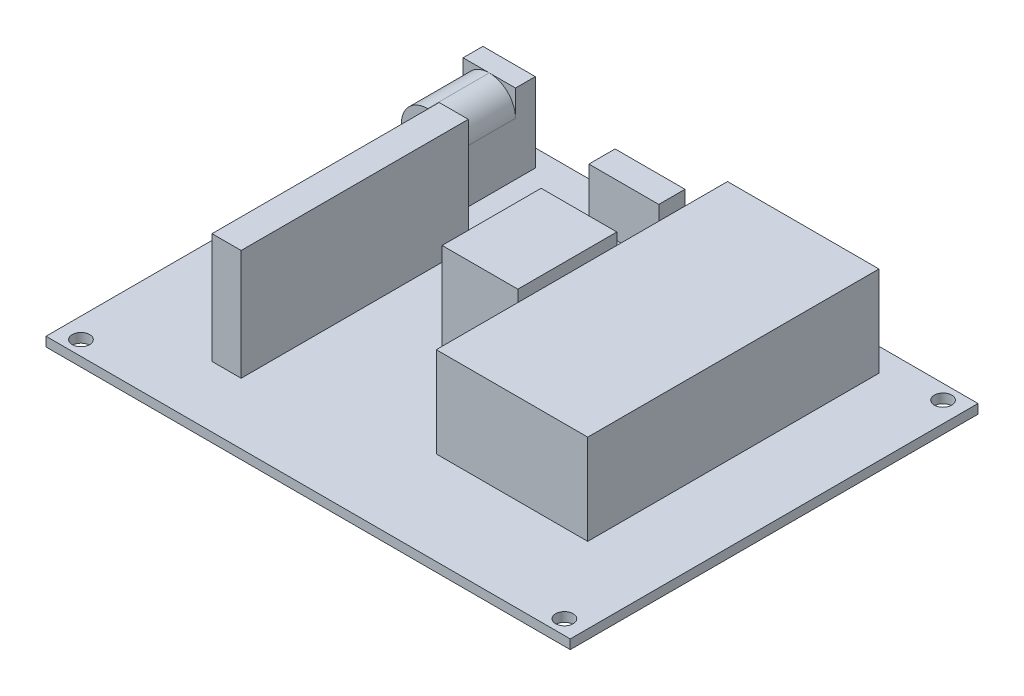
ISO-10303-21;
HEADER;
FILE_DESCRIPTION(('STEP AP214'),'2;1');
FILE_NAME('part.step','',(''),(''),'','','');
FILE_SCHEMA(('AUTOMOTIVE_DESIGN { 1 0 10303 214 1 1 1 1 }'));
ENDSEC;
DATA;
#1=APPLICATION_CONTEXT('core data for automotive mechanical design processes');
#2=APPLICATION_PROTOCOL_DEFINITION('international standard','automotive_design',2000,#1);
#3=PRODUCT_CONTEXT('',#1,'mechanical');
#4=PRODUCT('Part','Part','',(#3));
#5=PRODUCT_RELATED_PRODUCT_CATEGORY('part','',(#4));
#6=PRODUCT_DEFINITION_FORMATION('','',#4);
#7=PRODUCT_DEFINITION_CONTEXT('part definition',#1,'design');
#8=PRODUCT_DEFINITION('design','',#6,#7);
#9=PRODUCT_DEFINITION_SHAPE('','',#8);
#10=(LENGTH_UNIT() NAMED_UNIT(*) SI_UNIT(.MILLI.,.METRE.));
#11=(NAMED_UNIT(*) PLANE_ANGLE_UNIT() SI_UNIT($,.RADIAN.));
#12=(NAMED_UNIT(*) SI_UNIT($,.STERADIAN.) SOLID_ANGLE_UNIT());
#13=UNCERTAINTY_MEASURE_WITH_UNIT(LENGTH_MEASURE(1.E-05),#10,'distance_accuracy_value','');
#14=(GEOMETRIC_REPRESENTATION_CONTEXT(3) GLOBAL_UNCERTAINTY_ASSIGNED_CONTEXT((#13)) GLOBAL_UNIT_ASSIGNED_CONTEXT((#10,
#11,#12)) REPRESENTATION_CONTEXT('',''));
#15=CARTESIAN_POINT('',(0.,0.,0.));
#16=DIRECTION('',(0.,0.,1.));
#17=DIRECTION('',(1.,0.,0.));
#18=AXIS2_PLACEMENT_3D('',#15,#16,#17);
#19=CARTESIAN_POINT('',(0.,1.6,0.));
#20=DIRECTION('',(0.,-1.,0.));
#21=DIRECTION('',(0.,0.,-1.));
#22=AXIS2_PLACEMENT_3D('',#19,#20,#21);
#23=PLANE('',#22);
#24=DIRECTION('',(0.,0.,-1.));
#25=VECTOR('',#24,1.);
#26=CARTESIAN_POINT('',(-28.,1.6,-18.));
#27=LINE('',#26,#25);
#28=CARTESIAN_POINT('',(-28.,1.6,-18.));
#29=VERTEX_POINT('',#28);
#30=CARTESIAN_POINT('',(-28.,1.6,-32.));
#31=VERTEX_POINT('',#30);
#32=EDGE_CURVE('E247',#29,#31,#27,.T.);
#33=ORIENTED_EDGE('',*,*,#32,.F.);
#34=DIRECTION('',(1.,0.,0.));
#35=VECTOR('',#34,1.);
#36=CARTESIAN_POINT('',(-37.,1.6,-18.));
#37=LINE('',#36,#35);
#38=CARTESIAN_POINT('',(-37.,1.6,-18.));
#39=VERTEX_POINT('',#38);
#40=EDGE_CURVE('E254',#39,#29,#37,.T.);
#41=ORIENTED_EDGE('',*,*,#40,.F.);
#42=DIRECTION('',(0.,0.,1.));
#43=VECTOR('',#42,1.);
#44=CARTESIAN_POINT('',(-37.,1.6,-18.));
#45=LINE('',#44,#43);
#46=CARTESIAN_POINT('',(-37.,1.6,-32.));
#47=VERTEX_POINT('',#46);
#48=EDGE_CURVE('E265',#47,#39,#45,.T.);
#49=ORIENTED_EDGE('',*,*,#48,.F.);
#50=DIRECTION('',(-1.,0.,0.));
#51=VECTOR('',#50,1.);
#52=CARTESIAN_POINT('',(-37.,1.6,-32.));
#53=LINE('',#52,#51);
#54=EDGE_CURVE('E262',#31,#47,#53,.T.);
#55=ORIENTED_EDGE('',*,*,#54,.F.);
#56=EDGE_LOOP('',(#33,#41,#49,#55));
#57=FACE_BOUND('',#56,.T.);
#58=DIRECTION('',(0.,0.,-1.));
#59=VECTOR('',#58,1.);
#60=CARTESIAN_POINT('',(32.,1.6,19.));
#61=LINE('',#60,#59);
#62=CARTESIAN_POINT('',(32.,1.6,19.));
#63=VERTEX_POINT('',#62);
#64=CARTESIAN_POINT('',(32.,1.6,-31.));
#65=VERTEX_POINT('',#64);
#66=EDGE_CURVE('E312',#63,#65,#61,.T.);
#67=ORIENTED_EDGE('',*,*,#66,.F.);
#68=DIRECTION('',(1.,0.,0.));
#69=VECTOR('',#68,1.);
#70=CARTESIAN_POINT('',(5.99999999999999,1.6,19.));
#71=LINE('',#70,#69);
#72=CARTESIAN_POINT('',(5.99999999999999,1.6,19.));
#73=VERTEX_POINT('',#72);
#74=EDGE_CURVE('E317',#73,#63,#71,.T.);
#75=ORIENTED_EDGE('',*,*,#74,.F.);
#76=DIRECTION('',(0.,0.,1.));
#77=VECTOR('',#76,1.);
#78=CARTESIAN_POINT('',(5.99999999999999,1.6,19.));
#79=LINE('',#78,#77);
#80=CARTESIAN_POINT('',(5.99999999999999,1.6,-31.));
#81=VERTEX_POINT('',#80);
#82=EDGE_CURVE('E329',#81,#73,#79,.T.);
#83=ORIENTED_EDGE('',*,*,#82,.F.);
#84=DIRECTION('',(-1.,0.,0.));
#85=VECTOR('',#84,1.);
#86=CARTESIAN_POINT('',(5.99999999999999,1.6,-31.));
#87=LINE('',#86,#85);
#88=EDGE_CURVE('E326',#65,#81,#87,.T.);
#89=ORIENTED_EDGE('',*,*,#88,.F.);
#90=EDGE_LOOP('',(#67,#75,#83,#89));
#91=FACE_BOUND('',#90,.T.);
#92=DIRECTION('',(0.,0.,-1.));
#93=VECTOR('',#92,1.);
#94=CARTESIAN_POINT('',(45.,1.6,35.));
#95=LINE('',#94,#93);
#96=CARTESIAN_POINT('',(45.,1.6,35.));
#97=VERTEX_POINT('',#96);
#98=CARTESIAN_POINT('',(45.,1.6,-35.));
#99=VERTEX_POINT('',#98);
#100=EDGE_CURVE('E403',#97,#99,#95,.T.);
#101=ORIENTED_EDGE('',*,*,#100,.T.);
#102=DIRECTION('',(-1.,0.,0.));
#103=VECTOR('',#102,1.);
#104=CARTESIAN_POINT('',(-45.,1.6,-35.));
#105=LINE('',#104,#103);
#106=CARTESIAN_POINT('',(-45.,1.6,-35.));
#107=VERTEX_POINT('',#106);
#108=EDGE_CURVE('E406',#99,#107,#105,.T.);
#109=ORIENTED_EDGE('',*,*,#108,.T.);
#110=DIRECTION('',(0.,0.,1.));
#111=VECTOR('',#110,1.);
#112=CARTESIAN_POINT('',(-45.,1.6,35.));
#113=LINE('',#112,#111);
#114=CARTESIAN_POINT('',(-45.,1.6,35.));
#115=VERTEX_POINT('',#114);
#116=EDGE_CURVE('E409',#107,#115,#113,.T.);
#117=ORIENTED_EDGE('',*,*,#116,.T.);
#118=DIRECTION('',(1.,0.,0.));
#119=VECTOR('',#118,1.);
#120=CARTESIAN_POINT('',(-45.,1.6,35.));
#121=LINE('',#120,#119);
#122=EDGE_CURVE('E411',#115,#97,#121,.T.);
#123=ORIENTED_EDGE('',*,*,#122,.T.);
#124=EDGE_LOOP('',(#101,#109,#117,#123));
#125=FACE_BOUND('',#124,.T.);
#126=CARTESIAN_POINT('',(-41.5,1.6,-32.5));
#127=DIRECTION('',(0.,1.,0.));
#128=DIRECTION('',(0.,0.,1.));
#129=AXIS2_PLACEMENT_3D('',#126,#127,#128);
#130=CIRCLE('',#129,1.5);
#131=CARTESIAN_POINT('',(-41.5,1.6,-31.));
#132=VERTEX_POINT('',#131);
#133=EDGE_CURVE('E382',#132,#132,#130,.T.);
#134=ORIENTED_EDGE('',*,*,#133,.F.);
#135=EDGE_LOOP('',(#134));
#136=FACE_BOUND('',#135,.T.);
#137=CARTESIAN_POINT('',(41.5000000000006,1.6,-32.5));
#138=DIRECTION('',(0.,1.,0.));
#139=DIRECTION('',(0.,0.,1.));
#140=AXIS2_PLACEMENT_3D('',#137,#138,#139);
#141=CIRCLE('',#140,1.5);
#142=CARTESIAN_POINT('',(41.5000000000006,1.6,-31.));
#143=VERTEX_POINT('',#142);
#144=EDGE_CURVE('E383',#143,#143,#141,.T.);
#145=ORIENTED_EDGE('',*,*,#144,.F.);
#146=EDGE_LOOP('',(#145));
#147=FACE_BOUND('',#146,.T.);
#148=CARTESIAN_POINT('',(41.5000000000006,1.6,32.5));
#149=DIRECTION('',(0.,1.,0.));
#150=DIRECTION('',(0.,0.,1.));
#151=AXIS2_PLACEMENT_3D('',#148,#149,#150);
#152=CIRCLE('',#151,1.5);
#153=CARTESIAN_POINT('',(41.5000000000006,1.6,34.));
#154=VERTEX_POINT('',#153);
#155=EDGE_CURVE('E389',#154,#154,#152,.T.);
#156=ORIENTED_EDGE('',*,*,#155,.F.);
#157=EDGE_LOOP('',(#156));
#158=FACE_BOUND('',#157,.T.);
#159=CARTESIAN_POINT('',(-41.5,1.6,32.5));
#160=DIRECTION('',(0.,1.,0.));
#161=DIRECTION('',(0.,0.,1.));
#162=AXIS2_PLACEMENT_3D('',#159,#160,#161);
#163=CIRCLE('',#162,1.5);
#164=CARTESIAN_POINT('',(-41.5,1.6,34.));
#165=VERTEX_POINT('',#164);
#166=EDGE_CURVE('E378',#165,#165,#163,.T.);
#167=ORIENTED_EDGE('',*,*,#166,.F.);
#168=EDGE_LOOP('',(#167));
#169=FACE_BOUND('',#168,.T.);
#170=DIRECTION('',(0.,0.,-1.));
#171=VECTOR('',#170,1.);
#172=CARTESIAN_POINT('',(-22.,1.6,-14.5));
#173=LINE('',#172,#171);
#174=CARTESIAN_POINT('',(-22.,1.6,24.5));
#175=VERTEX_POINT('',#174);
#176=CARTESIAN_POINT('',(-22.,1.6,-14.5));
#177=VERTEX_POINT('',#176);
#178=EDGE_CURVE('E345',#175,#177,#173,.T.);
#179=ORIENTED_EDGE('',*,*,#178,.F.);
#180=DIRECTION('',(1.,0.,0.));
#181=VECTOR('',#180,1.);
#182=CARTESIAN_POINT('',(-27.,1.6,24.5));
#183=LINE('',#182,#181);
#184=CARTESIAN_POINT('',(-27.,1.6,24.5));
#185=VERTEX_POINT('',#184);
#186=EDGE_CURVE('E350',#185,#175,#183,.T.);
#187=ORIENTED_EDGE('',*,*,#186,.F.);
#188=DIRECTION('',(0.,0.,1.));
#189=VECTOR('',#188,1.);
#190=CARTESIAN_POINT('',(-27.,1.6,-14.5));
#191=LINE('',#190,#189);
#192=CARTESIAN_POINT('',(-27.,1.6,-14.5));
#193=VERTEX_POINT('',#192);
#194=EDGE_CURVE('E362',#193,#185,#191,.T.);
#195=ORIENTED_EDGE('',*,*,#194,.F.);
#196=DIRECTION('',(-1.,0.,0.));
#197=VECTOR('',#196,1.);
#198=CARTESIAN_POINT('',(-27.,1.6,-14.5));
#199=LINE('',#198,#197);
#200=EDGE_CURVE('E359',#177,#193,#199,.T.);
#201=ORIENTED_EDGE('',*,*,#200,.F.);
#202=EDGE_LOOP('',(#179,#187,#195,#201));
#203=FACE_BOUND('',#202,.T.);
#204=DIRECTION('',(0.,0.,-1.));
#205=VECTOR('',#204,1.);
#206=CARTESIAN_POINT('',(3.99999999999998,1.6,-14.));
#207=LINE('',#206,#205);
#208=CARTESIAN_POINT('',(3.99999999999998,1.6,3.));
#209=VERTEX_POINT('',#208);
#210=CARTESIAN_POINT('',(3.99999999999998,1.6,-14.));
#211=VERTEX_POINT('',#210);
#212=EDGE_CURVE('E279',#209,#211,#207,.T.);
#213=ORIENTED_EDGE('',*,*,#212,.F.);
#214=DIRECTION('',(1.,0.,0.));
#215=VECTOR('',#214,1.);
#216=CARTESIAN_POINT('',(-9.00000000000002,1.6,3.));
#217=LINE('',#216,#215);
#218=CARTESIAN_POINT('',(-9.00000000000002,1.6,3.));
#219=VERTEX_POINT('',#218);
#220=EDGE_CURVE('E284',#219,#209,#217,.T.);
#221=ORIENTED_EDGE('',*,*,#220,.F.);
#222=DIRECTION('',(0.,0.,1.));
#223=VECTOR('',#222,1.);
#224=CARTESIAN_POINT('',(-9.00000000000002,1.6,-14.));
#225=LINE('',#224,#223);
#226=CARTESIAN_POINT('',(-9.00000000000002,1.6,-14.));
#227=VERTEX_POINT('',#226);
#228=EDGE_CURVE('E296',#227,#219,#225,.T.);
#229=ORIENTED_EDGE('',*,*,#228,.F.);
#230=DIRECTION('',(-1.,0.,0.));
#231=VECTOR('',#230,1.);
#232=CARTESIAN_POINT('',(-9.00000000000002,1.6,-14.));
#233=LINE('',#232,#231);
#234=EDGE_CURVE('E293',#211,#227,#233,.T.);
#235=ORIENTED_EDGE('',*,*,#234,.F.);
#236=EDGE_LOOP('',(#213,#221,#229,#235));
#237=FACE_BOUND('',#236,.T.);
#238=DIRECTION('',(0.,0.,1.));
#239=VECTOR('',#238,1.);
#240=CARTESIAN_POINT('',(-15.,1.6,-28.2));
#241=LINE('',#240,#239);
#242=CARTESIAN_POINT('',(-15.,1.6,-32.7));
#243=VERTEX_POINT('',#242);
#244=CARTESIAN_POINT('',(-15.,1.6,-28.2));
#245=VERTEX_POINT('',#244);
#246=EDGE_CURVE('E235',#243,#245,#241,.T.);
#247=ORIENTED_EDGE('',*,*,#246,.F.);
#248=DIRECTION('',(-1.,0.,0.));
#249=VECTOR('',#248,1.);
#250=CARTESIAN_POINT('',(-3.00000000000002,1.6,-32.7));
#251=LINE('',#250,#249);
#252=CARTESIAN_POINT('',(-3.00000000000002,1.6,-32.7));
#253=VERTEX_POINT('',#252);
#254=EDGE_CURVE('E232',#253,#243,#251,.T.);
#255=ORIENTED_EDGE('',*,*,#254,.F.);
#256=DIRECTION('',(0.,0.,-1.));
#257=VECTOR('',#256,1.);
#258=CARTESIAN_POINT('',(-3.00000000000002,1.6,-28.2));
#259=LINE('',#258,#257);
#260=CARTESIAN_POINT('',(-3.00000000000002,1.6,-28.2));
#261=VERTEX_POINT('',#260);
#262=EDGE_CURVE('E57',#261,#253,#259,.T.);
#263=ORIENTED_EDGE('',*,*,#262,.F.);
#264=DIRECTION('',(1.,0.,0.));
#265=VECTOR('',#264,1.);
#266=CARTESIAN_POINT('',(-3.00000000000002,1.6,-28.2));
#267=LINE('',#266,#265);
#268=EDGE_CURVE('E52',#245,#261,#267,.T.);
#269=ORIENTED_EDGE('',*,*,#268,.F.);
#270=EDGE_LOOP('',(#247,#255,#263,#269));
#271=FACE_BOUND('',#270,.T.);
#272=ADVANCED_FACE('F35',(#57,#91,#125,#136,#147,#158,#169,#203,#237,#271),#23,.F.);
#273=CARTESIAN_POINT('',(45.,1.6,35.));
#274=DIRECTION('',(-1.,0.,0.));
#275=DIRECTION('',(0.,0.,1.));
#276=AXIS2_PLACEMENT_3D('',#273,#274,#275);
#277=PLANE('',#276);
#278=DIRECTION('',(0.,0.,-1.));
#279=VECTOR('',#278,1.);
#280=CARTESIAN_POINT('',(45.,0.,35.));
#281=LINE('',#280,#279);
#282=CARTESIAN_POINT('',(45.,0.,35.));
#283=VERTEX_POINT('',#282);
#284=CARTESIAN_POINT('',(45.,0.,-35.));
#285=VERTEX_POINT('',#284);
#286=EDGE_CURVE('E400',#283,#285,#281,.T.);
#287=ORIENTED_EDGE('',*,*,#286,.T.);
#288=DIRECTION('',(0.,-1.,0.));
#289=VECTOR('',#288,1.);
#290=CARTESIAN_POINT('',(45.,1.6,-35.));
#291=LINE('',#290,#289);
#292=EDGE_CURVE('E429',#99,#285,#291,.T.);
#293=ORIENTED_EDGE('',*,*,#292,.F.);
#294=ORIENTED_EDGE('',*,*,#100,.F.);
#295=DIRECTION('',(0.,-1.,0.));
#296=VECTOR('',#295,1.);
#297=CARTESIAN_POINT('',(45.,1.6,35.));
#298=LINE('',#297,#296);
#299=EDGE_CURVE('E413',#97,#283,#298,.T.);
#300=ORIENTED_EDGE('',*,*,#299,.T.);
#301=EDGE_LOOP('',(#287,#293,#294,#300));
#302=FACE_BOUND('',#301,.T.);
#303=ADVANCED_FACE('F498',(#302),#277,.F.);
#304=CARTESIAN_POINT('',(-45.,1.6,-35.));
#305=DIRECTION('',(0.,0.,1.));
#306=DIRECTION('',(1.,0.,0.));
#307=AXIS2_PLACEMENT_3D('',#304,#305,#306);
#308=PLANE('',#307);
#309=DIRECTION('',(-1.,0.,0.));
#310=VECTOR('',#309,1.);
#311=CARTESIAN_POINT('',(-45.,0.,-35.));
#312=LINE('',#311,#310);
#313=CARTESIAN_POINT('',(-45.,0.,-35.));
#314=VERTEX_POINT('',#313);
#315=EDGE_CURVE('E416',#285,#314,#312,.T.);
#316=ORIENTED_EDGE('',*,*,#315,.T.);
#317=DIRECTION('',(0.,-1.,0.));
#318=VECTOR('',#317,1.);
#319=CARTESIAN_POINT('',(-45.,1.6,-35.));
#320=LINE('',#319,#318);
#321=EDGE_CURVE('E426',#107,#314,#320,.T.);
#322=ORIENTED_EDGE('',*,*,#321,.F.);
#323=ORIENTED_EDGE('',*,*,#108,.F.);
#324=ORIENTED_EDGE('',*,*,#292,.T.);
#325=EDGE_LOOP('',(#316,#322,#323,#324));
#326=FACE_BOUND('',#325,.T.);
#327=ADVANCED_FACE('F505',(#326),#308,.F.);
#328=CARTESIAN_POINT('',(-45.,1.6,35.));
#329=DIRECTION('',(1.,0.,0.));
#330=DIRECTION('',(0.,0.,-1.));
#331=AXIS2_PLACEMENT_3D('',#328,#329,#330);
#332=PLANE('',#331);
#333=DIRECTION('',(0.,0.,1.));
#334=VECTOR('',#333,1.);
#335=CARTESIAN_POINT('',(-45.,0.,35.));
#336=LINE('',#335,#334);
#337=CARTESIAN_POINT('',(-45.,0.,35.));
#338=VERTEX_POINT('',#337);
#339=EDGE_CURVE('E418',#314,#338,#336,.T.);
#340=ORIENTED_EDGE('',*,*,#339,.T.);
#341=DIRECTION('',(0.,-1.,0.));
#342=VECTOR('',#341,1.);
#343=CARTESIAN_POINT('',(-45.,1.6,35.));
#344=LINE('',#343,#342);
#345=EDGE_CURVE('E423',#115,#338,#344,.T.);
#346=ORIENTED_EDGE('',*,*,#345,.F.);
#347=ORIENTED_EDGE('',*,*,#116,.F.);
#348=ORIENTED_EDGE('',*,*,#321,.T.);
#349=EDGE_LOOP('',(#340,#346,#347,#348));
#350=FACE_BOUND('',#349,.T.);
#351=ADVANCED_FACE('F519',(#350),#332,.F.);
#352=CARTESIAN_POINT('',(-45.,1.6,35.));
#353=DIRECTION('',(0.,0.,-1.));
#354=DIRECTION('',(-1.,0.,0.));
#355=AXIS2_PLACEMENT_3D('',#352,#353,#354);
#356=PLANE('',#355);
#357=DIRECTION('',(1.,0.,0.));
#358=VECTOR('',#357,1.);
#359=CARTESIAN_POINT('',(-45.,0.,35.));
#360=LINE('',#359,#358);
#361=EDGE_CURVE('E407',#338,#283,#360,.T.);
#362=ORIENTED_EDGE('',*,*,#361,.T.);
#363=ORIENTED_EDGE('',*,*,#299,.F.);
#364=ORIENTED_EDGE('',*,*,#122,.F.);
#365=ORIENTED_EDGE('',*,*,#345,.T.);
#366=EDGE_LOOP('',(#362,#363,#364,#365));
#367=FACE_BOUND('',#366,.T.);
#368=ADVANCED_FACE('F515',(#367),#356,.F.);
#369=CARTESIAN_POINT('',(0.,0.,0.));
#370=DIRECTION('',(0.,-1.,0.));
#371=DIRECTION('',(0.,0.,-1.));
#372=AXIS2_PLACEMENT_3D('',#369,#370,#371);
#373=PLANE('',#372);
#374=CARTESIAN_POINT('',(-41.5,0.,32.5));
#375=DIRECTION('',(0.,1.,0.));
#376=DIRECTION('',(0.,0.,1.));
#377=AXIS2_PLACEMENT_3D('',#374,#375,#376);
#378=CIRCLE('',#377,1.5);
#379=CARTESIAN_POINT('',(-41.5,0.,34.));
#380=VERTEX_POINT('',#379);
#381=EDGE_CURVE('E392',#380,#380,#378,.T.);
#382=ORIENTED_EDGE('',*,*,#381,.T.);
#383=EDGE_LOOP('',(#382));
#384=FACE_BOUND('',#383,.T.);
#385=CARTESIAN_POINT('',(41.5000000000006,0.,32.5));
#386=DIRECTION('',(0.,1.,0.));
#387=DIRECTION('',(0.,0.,1.));
#388=AXIS2_PLACEMENT_3D('',#385,#386,#387);
#389=CIRCLE('',#388,1.5);
#390=CARTESIAN_POINT('',(41.5000000000006,0.,34.));
#391=VERTEX_POINT('',#390);
#392=EDGE_CURVE('E386',#391,#391,#389,.T.);
#393=ORIENTED_EDGE('',*,*,#392,.T.);
#394=EDGE_LOOP('',(#393));
#395=FACE_BOUND('',#394,.T.);
#396=CARTESIAN_POINT('',(41.5000000000006,0.,-32.5));
#397=DIRECTION('',(0.,1.,0.));
#398=DIRECTION('',(0.,0.,1.));
#399=AXIS2_PLACEMENT_3D('',#396,#397,#398);
#400=CIRCLE('',#399,1.5);
#401=CARTESIAN_POINT('',(41.5000000000006,0.,-31.));
#402=VERTEX_POINT('',#401);
#403=EDGE_CURVE('E379',#402,#402,#400,.T.);
#404=ORIENTED_EDGE('',*,*,#403,.T.);
#405=EDGE_LOOP('',(#404));
#406=FACE_BOUND('',#405,.T.);
#407=CARTESIAN_POINT('',(-41.5,0.,-32.5));
#408=DIRECTION('',(0.,1.,0.));
#409=DIRECTION('',(0.,0.,1.));
#410=AXIS2_PLACEMENT_3D('',#407,#408,#409);
#411=CIRCLE('',#410,1.5);
#412=CARTESIAN_POINT('',(-41.5,0.,-31.));
#413=VERTEX_POINT('',#412);
#414=EDGE_CURVE('E397',#413,#413,#411,.T.);
#415=ORIENTED_EDGE('',*,*,#414,.T.);
#416=EDGE_LOOP('',(#415));
#417=FACE_BOUND('',#416,.T.);
#418=ORIENTED_EDGE('',*,*,#286,.F.);
#419=ORIENTED_EDGE('',*,*,#361,.F.);
#420=ORIENTED_EDGE('',*,*,#339,.F.);
#421=ORIENTED_EDGE('',*,*,#315,.F.);
#422=EDGE_LOOP('',(#418,#419,#420,#421));
#423=FACE_BOUND('',#422,.T.);
#424=ADVANCED_FACE('F512',(#384,#395,#406,#417,#423),#373,.T.);
#425=CARTESIAN_POINT('',(-41.5,0.,-32.5));
#426=DIRECTION('',(0.,1.,0.));
#427=DIRECTION('',(0.,0.,1.));
#428=AXIS2_PLACEMENT_3D('',#425,#426,#427);
#429=CYLINDRICAL_SURFACE('',#428,1.5);
#430=ORIENTED_EDGE('',*,*,#414,.F.);
#431=EDGE_LOOP('',(#430));
#432=FACE_BOUND('',#431,.T.);
#433=ORIENTED_EDGE('',*,*,#133,.T.);
#434=EDGE_LOOP('',(#433));
#435=FACE_BOUND('',#434,.T.);
#436=ADVANCED_FACE('F510',(#432,#435),#429,.F.);
#437=CARTESIAN_POINT('',(41.5000000000006,0.,-32.5));
#438=DIRECTION('',(0.,1.,0.));
#439=DIRECTION('',(0.,0.,1.));
#440=AXIS2_PLACEMENT_3D('',#437,#438,#439);
#441=CYLINDRICAL_SURFACE('',#440,1.5);
#442=ORIENTED_EDGE('',*,*,#403,.F.);
#443=EDGE_LOOP('',(#442));
#444=FACE_BOUND('',#443,.T.);
#445=ORIENTED_EDGE('',*,*,#144,.T.);
#446=EDGE_LOOP('',(#445));
#447=FACE_BOUND('',#446,.T.);
#448=ADVANCED_FACE('F728',(#444,#447),#441,.F.);
#449=CARTESIAN_POINT('',(41.5000000000006,0.,32.5));
#450=DIRECTION('',(0.,1.,0.));
#451=DIRECTION('',(0.,0.,1.));
#452=AXIS2_PLACEMENT_3D('',#449,#450,#451);
#453=CYLINDRICAL_SURFACE('',#452,1.5);
#454=ORIENTED_EDGE('',*,*,#392,.F.);
#455=EDGE_LOOP('',(#454));
#456=FACE_BOUND('',#455,.T.);
#457=ORIENTED_EDGE('',*,*,#155,.T.);
#458=EDGE_LOOP('',(#457));
#459=FACE_BOUND('',#458,.T.);
#460=ADVANCED_FACE('F721',(#456,#459),#453,.F.);
#461=CARTESIAN_POINT('',(-41.5,0.,32.5));
#462=DIRECTION('',(0.,1.,0.));
#463=DIRECTION('',(0.,0.,1.));
#464=AXIS2_PLACEMENT_3D('',#461,#462,#463);
#465=CYLINDRICAL_SURFACE('',#464,1.5);
#466=ORIENTED_EDGE('',*,*,#381,.F.);
#467=EDGE_LOOP('',(#466));
#468=FACE_BOUND('',#467,.T.);
#469=ORIENTED_EDGE('',*,*,#166,.T.);
#470=EDGE_LOOP('',(#469));
#471=FACE_BOUND('',#470,.T.);
#472=ADVANCED_FACE('F707',(#468,#471),#465,.F.);
#473=CARTESIAN_POINT('',(-22.,20.6,-14.5));
#474=DIRECTION('',(-1.,0.,0.));
#475=DIRECTION('',(0.,0.,1.));
#476=AXIS2_PLACEMENT_3D('',#473,#474,#475);
#477=PLANE('',#476);
#478=ORIENTED_EDGE('',*,*,#178,.T.);
#479=DIRECTION('',(0.,-1.,0.));
#480=VECTOR('',#479,1.);
#481=CARTESIAN_POINT('',(-22.,20.6,-14.5));
#482=LINE('',#481,#480);
#483=CARTESIAN_POINT('',(-22.,20.6,-14.5));
#484=VERTEX_POINT('',#483);
#485=EDGE_CURVE('E375',#484,#177,#482,.T.);
#486=ORIENTED_EDGE('',*,*,#485,.F.);
#487=DIRECTION('',(0.,0.,-1.));
#488=VECTOR('',#487,1.);
#489=CARTESIAN_POINT('',(-22.,20.6,-14.5));
#490=LINE('',#489,#488);
#491=CARTESIAN_POINT('',(-22.,20.6,24.5));
#492=VERTEX_POINT('',#491);
#493=EDGE_CURVE('E346',#492,#484,#490,.T.);
#494=ORIENTED_EDGE('',*,*,#493,.F.);
#495=DIRECTION('',(0.,-1.,0.));
#496=VECTOR('',#495,1.);
#497=CARTESIAN_POINT('',(-22.,20.6,24.5));
#498=LINE('',#497,#496);
#499=EDGE_CURVE('E356',#492,#175,#498,.T.);
#500=ORIENTED_EDGE('',*,*,#499,.T.);
#501=EDGE_LOOP('',(#478,#486,#494,#500));
#502=FACE_BOUND('',#501,.T.);
#503=ADVANCED_FACE('F699',(#502),#477,.F.);
#504=CARTESIAN_POINT('',(-27.,20.6,-14.5));
#505=DIRECTION('',(0.,0.,1.));
#506=DIRECTION('',(1.,0.,0.));
#507=AXIS2_PLACEMENT_3D('',#504,#505,#506);
#508=PLANE('',#507);
#509=ORIENTED_EDGE('',*,*,#200,.T.);
#510=DIRECTION('',(0.,-1.,0.));
#511=VECTOR('',#510,1.);
#512=CARTESIAN_POINT('',(-27.,20.6,-14.5));
#513=LINE('',#512,#511);
#514=CARTESIAN_POINT('',(-27.,20.6,-14.5));
#515=VERTEX_POINT('',#514);
#516=EDGE_CURVE('E372',#515,#193,#513,.T.);
#517=ORIENTED_EDGE('',*,*,#516,.F.);
#518=DIRECTION('',(-1.,0.,0.));
#519=VECTOR('',#518,1.);
#520=CARTESIAN_POINT('',(-27.,20.6,-14.5));
#521=LINE('',#520,#519);
#522=EDGE_CURVE('E349',#484,#515,#521,.T.);
#523=ORIENTED_EDGE('',*,*,#522,.F.);
#524=ORIENTED_EDGE('',*,*,#485,.T.);
#525=EDGE_LOOP('',(#509,#517,#523,#524));
#526=FACE_BOUND('',#525,.T.);
#527=ADVANCED_FACE('F691',(#526),#508,.F.);
#528=CARTESIAN_POINT('',(-27.,20.6,-14.5));
#529=DIRECTION('',(1.,0.,0.));
#530=DIRECTION('',(0.,0.,-1.));
#531=AXIS2_PLACEMENT_3D('',#528,#529,#530);
#532=PLANE('',#531);
#533=ORIENTED_EDGE('',*,*,#194,.T.);
#534=DIRECTION('',(0.,-1.,0.));
#535=VECTOR('',#534,1.);
#536=CARTESIAN_POINT('',(-27.,20.6,24.5));
#537=LINE('',#536,#535);
#538=CARTESIAN_POINT('',(-27.,20.6,24.5));
#539=VERTEX_POINT('',#538);
#540=EDGE_CURVE('E369',#539,#185,#537,.T.);
#541=ORIENTED_EDGE('',*,*,#540,.F.);
#542=DIRECTION('',(0.,0.,1.));
#543=VECTOR('',#542,1.);
#544=CARTESIAN_POINT('',(-27.,20.6,-14.5));
#545=LINE('',#544,#543);
#546=EDGE_CURVE('E352',#515,#539,#545,.T.);
#547=ORIENTED_EDGE('',*,*,#546,.F.);
#548=ORIENTED_EDGE('',*,*,#516,.T.);
#549=EDGE_LOOP('',(#533,#541,#547,#548));
#550=FACE_BOUND('',#549,.T.);
#551=ADVANCED_FACE('F683',(#550),#532,.F.);
#552=CARTESIAN_POINT('',(-27.,20.6,24.5));
#553=DIRECTION('',(0.,0.,-1.));
#554=DIRECTION('',(-1.,0.,0.));
#555=AXIS2_PLACEMENT_3D('',#552,#553,#554);
#556=PLANE('',#555);
#557=ORIENTED_EDGE('',*,*,#186,.T.);
#558=ORIENTED_EDGE('',*,*,#499,.F.);
#559=DIRECTION('',(1.,0.,0.));
#560=VECTOR('',#559,1.);
#561=CARTESIAN_POINT('',(-27.,20.6,24.5));
#562=LINE('',#561,#560);
#563=EDGE_CURVE('E354',#539,#492,#562,.T.);
#564=ORIENTED_EDGE('',*,*,#563,.F.);
#565=ORIENTED_EDGE('',*,*,#540,.T.);
#566=EDGE_LOOP('',(#557,#558,#564,#565));
#567=FACE_BOUND('',#566,.T.);
#568=ADVANCED_FACE('F675',(#567),#556,.F.);
#569=CARTESIAN_POINT('',(0.,20.6,0.));
#570=DIRECTION('',(0.,1.,0.));
#571=DIRECTION('',(0.,0.,1.));
#572=AXIS2_PLACEMENT_3D('',#569,#570,#571);
#573=PLANE('',#572);
#574=ORIENTED_EDGE('',*,*,#493,.T.);
#575=ORIENTED_EDGE('',*,*,#522,.T.);
#576=ORIENTED_EDGE('',*,*,#546,.T.);
#577=ORIENTED_EDGE('',*,*,#563,.T.);
#578=EDGE_LOOP('',(#574,#575,#576,#577));
#579=FACE_BOUND('',#578,.T.);
#580=ADVANCED_FACE('F667',(#579),#573,.T.);
#581=CARTESIAN_POINT('',(32.,17.1,19.));
#582=DIRECTION('',(-1.,0.,0.));
#583=DIRECTION('',(0.,0.,1.));
#584=AXIS2_PLACEMENT_3D('',#581,#582,#583);
#585=PLANE('',#584);
#586=ORIENTED_EDGE('',*,*,#66,.T.);
#587=DIRECTION('',(0.,-1.,0.));
#588=VECTOR('',#587,1.);
#589=CARTESIAN_POINT('',(32.,17.1,-31.));
#590=LINE('',#589,#588);
#591=CARTESIAN_POINT('',(32.,17.1,-31.));
#592=VERTEX_POINT('',#591);
#593=EDGE_CURVE('E342',#592,#65,#590,.T.);
#594=ORIENTED_EDGE('',*,*,#593,.F.);
#595=DIRECTION('',(0.,0.,-1.));
#596=VECTOR('',#595,1.);
#597=CARTESIAN_POINT('',(32.,17.1,19.));
#598=LINE('',#597,#596);
#599=CARTESIAN_POINT('',(32.,17.1,19.));
#600=VERTEX_POINT('',#599);
#601=EDGE_CURVE('E313',#600,#592,#598,.T.);
#602=ORIENTED_EDGE('',*,*,#601,.F.);
#603=DIRECTION('',(0.,-1.,0.));
#604=VECTOR('',#603,1.);
#605=CARTESIAN_POINT('',(32.,17.1,19.));
#606=LINE('',#605,#604);
#607=EDGE_CURVE('E323',#600,#63,#606,.T.);
#608=ORIENTED_EDGE('',*,*,#607,.T.);
#609=EDGE_LOOP('',(#586,#594,#602,#608));
#610=FACE_BOUND('',#609,.T.);
#611=ADVANCED_FACE('F659',(#610),#585,.F.);
#612=CARTESIAN_POINT('',(5.99999999999999,17.1,-31.));
#613=DIRECTION('',(0.,0.,1.));
#614=DIRECTION('',(1.,0.,0.));
#615=AXIS2_PLACEMENT_3D('',#612,#613,#614);
#616=PLANE('',#615);
#617=ORIENTED_EDGE('',*,*,#88,.T.);
#618=DIRECTION('',(0.,-1.,0.));
#619=VECTOR('',#618,1.);
#620=CARTESIAN_POINT('',(5.99999999999999,17.1,-31.));
#621=LINE('',#620,#619);
#622=CARTESIAN_POINT('',(5.99999999999999,17.1,-31.));
#623=VERTEX_POINT('',#622);
#624=EDGE_CURVE('E339',#623,#81,#621,.T.);
#625=ORIENTED_EDGE('',*,*,#624,.F.);
#626=DIRECTION('',(-1.,0.,0.));
#627=VECTOR('',#626,1.);
#628=CARTESIAN_POINT('',(5.99999999999999,17.1,-31.));
#629=LINE('',#628,#627);
#630=EDGE_CURVE('E316',#592,#623,#629,.T.);
#631=ORIENTED_EDGE('',*,*,#630,.F.);
#632=ORIENTED_EDGE('',*,*,#593,.T.);
#633=EDGE_LOOP('',(#617,#625,#631,#632));
#634=FACE_BOUND('',#633,.T.);
#635=ADVANCED_FACE('F651',(#634),#616,.F.);
#636=CARTESIAN_POINT('',(5.99999999999999,17.1,19.));
#637=DIRECTION('',(1.,0.,0.));
#638=DIRECTION('',(0.,0.,-1.));
#639=AXIS2_PLACEMENT_3D('',#636,#637,#638);
#640=PLANE('',#639);
#641=ORIENTED_EDGE('',*,*,#82,.T.);
#642=DIRECTION('',(0.,-1.,0.));
#643=VECTOR('',#642,1.);
#644=CARTESIAN_POINT('',(5.99999999999999,17.1,19.));
#645=LINE('',#644,#643);
#646=CARTESIAN_POINT('',(5.99999999999999,17.1,19.));
#647=VERTEX_POINT('',#646);
#648=EDGE_CURVE('E336',#647,#73,#645,.T.);
#649=ORIENTED_EDGE('',*,*,#648,.F.);
#650=DIRECTION('',(0.,0.,1.));
#651=VECTOR('',#650,1.);
#652=CARTESIAN_POINT('',(5.99999999999999,17.1,19.));
#653=LINE('',#652,#651);
#654=EDGE_CURVE('E319',#623,#647,#653,.T.);
#655=ORIENTED_EDGE('',*,*,#654,.F.);
#656=ORIENTED_EDGE('',*,*,#624,.T.);
#657=EDGE_LOOP('',(#641,#649,#655,#656));
#658=FACE_BOUND('',#657,.T.);
#659=ADVANCED_FACE('F643',(#658),#640,.F.);
#660=CARTESIAN_POINT('',(5.99999999999999,17.1,19.));
#661=DIRECTION('',(0.,0.,-1.));
#662=DIRECTION('',(-1.,0.,0.));
#663=AXIS2_PLACEMENT_3D('',#660,#661,#662);
#664=PLANE('',#663);
#665=ORIENTED_EDGE('',*,*,#74,.T.);
#666=ORIENTED_EDGE('',*,*,#607,.F.);
#667=DIRECTION('',(1.,0.,0.));
#668=VECTOR('',#667,1.);
#669=CARTESIAN_POINT('',(5.99999999999999,17.1,19.));
#670=LINE('',#669,#668);
#671=EDGE_CURVE('E321',#647,#600,#670,.T.);
#672=ORIENTED_EDGE('',*,*,#671,.F.);
#673=ORIENTED_EDGE('',*,*,#648,.T.);
#674=EDGE_LOOP('',(#665,#666,#672,#673));
#675=FACE_BOUND('',#674,.T.);
#676=ADVANCED_FACE('F635',(#675),#664,.F.);
#677=CARTESIAN_POINT('',(0.,17.1,0.));
#678=DIRECTION('',(0.,-1.,0.));
#679=DIRECTION('',(0.,0.,-1.));
#680=AXIS2_PLACEMENT_3D('',#677,#678,#679);
#681=PLANE('',#680);
#682=ORIENTED_EDGE('',*,*,#601,.T.);
#683=ORIENTED_EDGE('',*,*,#630,.T.);
#684=ORIENTED_EDGE('',*,*,#654,.T.);
#685=ORIENTED_EDGE('',*,*,#671,.T.);
#686=EDGE_LOOP('',(#682,#683,#684,#685));
#687=FACE_BOUND('',#686,.T.);
#688=ADVANCED_FACE('F627',(#687),#681,.F.);
#689=CARTESIAN_POINT('',(3.99999999999998,17.1,-14.));
#690=DIRECTION('',(-1.,0.,0.));
#691=DIRECTION('',(0.,0.,1.));
#692=AXIS2_PLACEMENT_3D('',#689,#690,#691);
#693=PLANE('',#692);
#694=ORIENTED_EDGE('',*,*,#212,.T.);
#695=DIRECTION('',(0.,-1.,0.));
#696=VECTOR('',#695,1.);
#697=CARTESIAN_POINT('',(3.99999999999998,17.1,-14.));
#698=LINE('',#697,#696);
#699=CARTESIAN_POINT('',(3.99999999999998,17.1,-14.));
#700=VERTEX_POINT('',#699);
#701=EDGE_CURVE('E309',#700,#211,#698,.T.);
#702=ORIENTED_EDGE('',*,*,#701,.F.);
#703=DIRECTION('',(0.,0.,-1.));
#704=VECTOR('',#703,1.);
#705=CARTESIAN_POINT('',(3.99999999999998,17.1,-14.));
#706=LINE('',#705,#704);
#707=CARTESIAN_POINT('',(3.99999999999998,17.1,3.));
#708=VERTEX_POINT('',#707);
#709=EDGE_CURVE('E280',#708,#700,#706,.T.);
#710=ORIENTED_EDGE('',*,*,#709,.F.);
#711=DIRECTION('',(0.,-1.,0.));
#712=VECTOR('',#711,1.);
#713=CARTESIAN_POINT('',(3.99999999999998,17.1,3.));
#714=LINE('',#713,#712);
#715=EDGE_CURVE('E290',#708,#209,#714,.T.);
#716=ORIENTED_EDGE('',*,*,#715,.T.);
#717=EDGE_LOOP('',(#694,#702,#710,#716));
#718=FACE_BOUND('',#717,.T.);
#719=ADVANCED_FACE('F619',(#718),#693,.F.);
#720=CARTESIAN_POINT('',(-9.00000000000002,17.1,-14.));
#721=DIRECTION('',(0.,0.,1.));
#722=DIRECTION('',(1.,0.,0.));
#723=AXIS2_PLACEMENT_3D('',#720,#721,#722);
#724=PLANE('',#723);
#725=ORIENTED_EDGE('',*,*,#234,.T.);
#726=DIRECTION('',(0.,-1.,0.));
#727=VECTOR('',#726,1.);
#728=CARTESIAN_POINT('',(-9.00000000000002,17.1,-14.));
#729=LINE('',#728,#727);
#730=CARTESIAN_POINT('',(-9.00000000000002,17.1,-14.));
#731=VERTEX_POINT('',#730);
#732=EDGE_CURVE('E306',#731,#227,#729,.T.);
#733=ORIENTED_EDGE('',*,*,#732,.F.);
#734=DIRECTION('',(-1.,0.,0.));
#735=VECTOR('',#734,1.);
#736=CARTESIAN_POINT('',(-9.00000000000002,17.1,-14.));
#737=LINE('',#736,#735);
#738=EDGE_CURVE('E283',#700,#731,#737,.T.);
#739=ORIENTED_EDGE('',*,*,#738,.F.);
#740=ORIENTED_EDGE('',*,*,#701,.T.);
#741=EDGE_LOOP('',(#725,#733,#739,#740));
#742=FACE_BOUND('',#741,.T.);
#743=ADVANCED_FACE('F611',(#742),#724,.F.);
#744=CARTESIAN_POINT('',(-9.00000000000002,17.1,-14.));
#745=DIRECTION('',(1.,0.,0.));
#746=DIRECTION('',(0.,0.,-1.));
#747=AXIS2_PLACEMENT_3D('',#744,#745,#746);
#748=PLANE('',#747);
#749=ORIENTED_EDGE('',*,*,#228,.T.);
#750=DIRECTION('',(0.,-1.,0.));
#751=VECTOR('',#750,1.);
#752=CARTESIAN_POINT('',(-9.00000000000002,17.1,3.));
#753=LINE('',#752,#751);
#754=CARTESIAN_POINT('',(-9.00000000000002,17.1,3.));
#755=VERTEX_POINT('',#754);
#756=EDGE_CURVE('E303',#755,#219,#753,.T.);
#757=ORIENTED_EDGE('',*,*,#756,.F.);
#758=DIRECTION('',(0.,0.,1.));
#759=VECTOR('',#758,1.);
#760=CARTESIAN_POINT('',(-9.00000000000002,17.1,-14.));
#761=LINE('',#760,#759);
#762=EDGE_CURVE('E286',#731,#755,#761,.T.);
#763=ORIENTED_EDGE('',*,*,#762,.F.);
#764=ORIENTED_EDGE('',*,*,#732,.T.);
#765=EDGE_LOOP('',(#749,#757,#763,#764));
#766=FACE_BOUND('',#765,.T.);
#767=ADVANCED_FACE('F603',(#766),#748,.F.);
#768=CARTESIAN_POINT('',(-9.00000000000002,17.1,3.));
#769=DIRECTION('',(0.,0.,-1.));
#770=DIRECTION('',(-1.,0.,0.));
#771=AXIS2_PLACEMENT_3D('',#768,#769,#770);
#772=PLANE('',#771);
#773=ORIENTED_EDGE('',*,*,#220,.T.);
#774=ORIENTED_EDGE('',*,*,#715,.F.);
#775=DIRECTION('',(1.,0.,0.));
#776=VECTOR('',#775,1.);
#777=CARTESIAN_POINT('',(-9.00000000000002,17.1,3.));
#778=LINE('',#777,#776);
#779=EDGE_CURVE('E288',#755,#708,#778,.T.);
#780=ORIENTED_EDGE('',*,*,#779,.F.);
#781=ORIENTED_EDGE('',*,*,#756,.T.);
#782=EDGE_LOOP('',(#773,#774,#780,#781));
#783=FACE_BOUND('',#782,.T.);
#784=ADVANCED_FACE('F596',(#783),#772,.F.);
#785=CARTESIAN_POINT('',(0.,17.1,0.));
#786=DIRECTION('',(0.,1.,0.));
#787=DIRECTION('',(0.,0.,1.));
#788=AXIS2_PLACEMENT_3D('',#785,#786,#787);
#789=PLANE('',#788);
#790=ORIENTED_EDGE('',*,*,#709,.T.);
#791=ORIENTED_EDGE('',*,*,#738,.T.);
#792=ORIENTED_EDGE('',*,*,#762,.T.);
#793=ORIENTED_EDGE('',*,*,#779,.T.);
#794=EDGE_LOOP('',(#790,#791,#792,#793));
#795=FACE_BOUND('',#794,.T.);
#796=ADVANCED_FACE('F494',(#795),#789,.T.);
#797=CARTESIAN_POINT('',(-28.,15.2,-18.));
#798=DIRECTION('',(-1.,0.,0.));
#799=DIRECTION('',(0.,0.,1.));
#800=AXIS2_PLACEMENT_3D('',#797,#798,#799);
#801=PLANE('',#800);
#802=DIRECTION('',(0.,0.,-1.));
#803=VECTOR('',#802,1.);
#804=CARTESIAN_POINT('',(-28.,15.2,-18.));
#805=LINE('',#804,#803);
#806=CARTESIAN_POINT('',(-28.,15.2,-28.6));
#807=VERTEX_POINT('',#806);
#808=CARTESIAN_POINT('',(-28.,15.2,-32.));
#809=VERTEX_POINT('',#808);
#810=EDGE_CURVE('E251',#807,#809,#805,.T.);
#811=ORIENTED_EDGE('',*,*,#810,.F.);
#812=DIRECTION('',(0.,-1.,0.));
#813=VECTOR('',#812,1.);
#814=CARTESIAN_POINT('',(-28.,10.7,-28.6));
#815=LINE('',#814,#813);
#816=CARTESIAN_POINT('',(-28.,10.7,-28.6));
#817=VERTEX_POINT('',#816);
#818=EDGE_CURVE('E11',#807,#817,#815,.T.);
#819=ORIENTED_EDGE('',*,*,#818,.T.);
#820=DIRECTION('',(0.,0.,-1.));
#821=VECTOR('',#820,1.);
#822=CARTESIAN_POINT('',(-28.,10.7,-18.));
#823=LINE('',#822,#821);
#824=CARTESIAN_POINT('',(-28.,10.7,-18.));
#825=VERTEX_POINT('',#824);
#826=EDGE_CURVE('E44',#817,#825,#823,.F.);
#827=ORIENTED_EDGE('',*,*,#826,.T.);
#828=DIRECTION('',(0.,-1.,0.));
#829=VECTOR('',#828,1.);
#830=CARTESIAN_POINT('',(-28.,15.2,-18.));
#831=LINE('',#830,#829);
#832=EDGE_CURVE('E259',#825,#29,#831,.T.);
#833=ORIENTED_EDGE('',*,*,#832,.T.);
#834=ORIENTED_EDGE('',*,*,#32,.T.);
#835=DIRECTION('',(0.,-1.,0.));
#836=VECTOR('',#835,1.);
#837=CARTESIAN_POINT('',(-28.,15.2,-32.));
#838=LINE('',#837,#836);
#839=EDGE_CURVE('E276',#809,#31,#838,.T.);
#840=ORIENTED_EDGE('',*,*,#839,.F.);
#841=EDGE_LOOP('',(#811,#819,#827,#833,#834,#840));
#842=FACE_BOUND('',#841,.T.);
#843=ADVANCED_FACE('F481',(#842),#801,.F.);
#844=CARTESIAN_POINT('',(-37.,15.2,-32.));
#845=DIRECTION('',(0.,0.,1.));
#846=DIRECTION('',(1.,0.,0.));
#847=AXIS2_PLACEMENT_3D('',#844,#845,#846);
#848=PLANE('',#847);
#849=CARTESIAN_POINT('',(-32.5,10.7,-32.));
#850=DIRECTION('',(0.,0.,-1.));
#851=DIRECTION('',(-1.,0.,0.));
#852=AXIS2_PLACEMENT_3D('',#849,#850,#851);
#853=CIRCLE('',#852,2.7);
#854=CARTESIAN_POINT('',(-35.2,10.7,-32.));
#855=VERTEX_POINT('',#854);
#856=EDGE_CURVE('E248',#855,#855,#853,.T.);
#857=ORIENTED_EDGE('',*,*,#856,.F.);
#858=EDGE_LOOP('',(#857));
#859=FACE_BOUND('',#858,.T.);
#860=ORIENTED_EDGE('',*,*,#54,.T.);
#861=DIRECTION('',(0.,-1.,0.));
#862=VECTOR('',#861,1.);
#863=CARTESIAN_POINT('',(-37.,15.2,-32.));
#864=LINE('',#863,#862);
#865=CARTESIAN_POINT('',(-37.,15.2,-32.));
#866=VERTEX_POINT('',#865);
#867=EDGE_CURVE('E273',#866,#47,#864,.T.);
#868=ORIENTED_EDGE('',*,*,#867,.F.);
#869=DIRECTION('',(-1.,0.,0.));
#870=VECTOR('',#869,1.);
#871=CARTESIAN_POINT('',(-37.,15.2,-32.));
#872=LINE('',#871,#870);
#873=EDGE_CURVE('E253',#809,#866,#872,.T.);
#874=ORIENTED_EDGE('',*,*,#873,.F.);
#875=ORIENTED_EDGE('',*,*,#839,.T.);
#876=EDGE_LOOP('',(#860,#868,#874,#875));
#877=FACE_BOUND('',#876,.T.);
#878=ADVANCED_FACE('F485',(#859,#877),#848,.F.);
#879=CARTESIAN_POINT('',(-37.,15.2,-18.));
#880=DIRECTION('',(1.,0.,0.));
#881=DIRECTION('',(0.,0.,-1.));
#882=AXIS2_PLACEMENT_3D('',#879,#880,#881);
#883=PLANE('',#882);
#884=DIRECTION('',(0.,-1.,0.));
#885=VECTOR('',#884,1.);
#886=CARTESIAN_POINT('',(-37.,15.2,-18.));
#887=LINE('',#886,#885);
#888=CARTESIAN_POINT('',(-37.,10.7,-18.));
#889=VERTEX_POINT('',#888);
#890=EDGE_CURVE('E271',#889,#39,#887,.T.);
#891=ORIENTED_EDGE('',*,*,#890,.F.);
#892=DIRECTION('',(0.,0.,1.));
#893=VECTOR('',#892,1.);
#894=CARTESIAN_POINT('',(-37.,10.7,-18.));
#895=LINE('',#894,#893);
#896=CARTESIAN_POINT('',(-37.,10.7,-28.6));
#897=VERTEX_POINT('',#896);
#898=EDGE_CURVE('E443',#889,#897,#895,.F.);
#899=ORIENTED_EDGE('',*,*,#898,.T.);
#900=DIRECTION('',(0.,1.,0.));
#901=VECTOR('',#900,1.);
#902=CARTESIAN_POINT('',(-37.,10.7,-28.6));
#903=LINE('',#902,#901);
#904=CARTESIAN_POINT('',(-37.,15.2,-28.6));
#905=VERTEX_POINT('',#904);
#906=EDGE_CURVE('E441',#897,#905,#903,.T.);
#907=ORIENTED_EDGE('',*,*,#906,.T.);
#908=DIRECTION('',(0.,0.,1.));
#909=VECTOR('',#908,1.);
#910=CARTESIAN_POINT('',(-37.,15.2,-18.));
#911=LINE('',#910,#909);
#912=EDGE_CURVE('E256',#866,#905,#911,.T.);
#913=ORIENTED_EDGE('',*,*,#912,.F.);
#914=ORIENTED_EDGE('',*,*,#867,.T.);
#915=ORIENTED_EDGE('',*,*,#48,.T.);
#916=EDGE_LOOP('',(#891,#899,#907,#913,#914,#915));
#917=FACE_BOUND('',#916,.T.);
#918=ADVANCED_FACE('F471',(#917),#883,.F.);
#919=CARTESIAN_POINT('',(-37.,15.2,-18.));
#920=DIRECTION('',(0.,0.,-1.));
#921=DIRECTION('',(-1.,0.,0.));
#922=AXIS2_PLACEMENT_3D('',#919,#920,#921);
#923=PLANE('',#922);
#924=CARTESIAN_POINT('',(-32.5,10.7,-18.));
#925=DIRECTION('',(0.,0.,-1.));
#926=DIRECTION('',(-1.,0.,0.));
#927=AXIS2_PLACEMENT_3D('',#924,#925,#926);
#928=CIRCLE('',#927,4.5);
#929=CARTESIAN_POINT('',(-32.5,15.2,-18.));
#930=VERTEX_POINT('',#929);
#931=EDGE_CURVE('E437',#825,#930,#928,.F.);
#932=ORIENTED_EDGE('',*,*,#931,.T.);
#933=CARTESIAN_POINT('',(-32.5,10.7,-18.));
#934=DIRECTION('',(0.,0.,-1.));
#935=DIRECTION('',(-1.,0.,0.));
#936=AXIS2_PLACEMENT_3D('',#933,#934,#935);
#937=CIRCLE('',#936,4.5);
#938=EDGE_CURVE('E439',#930,#889,#937,.F.);
#939=ORIENTED_EDGE('',*,*,#938,.T.);
#940=ORIENTED_EDGE('',*,*,#890,.T.);
#941=ORIENTED_EDGE('',*,*,#40,.T.);
#942=ORIENTED_EDGE('',*,*,#832,.F.);
#943=EDGE_LOOP('',(#932,#939,#940,#941,#942));
#944=FACE_BOUND('',#943,.T.);
#945=ADVANCED_FACE('F474',(#944),#923,.F.);
#946=CARTESIAN_POINT('',(0.,15.2,0.));
#947=DIRECTION('',(0.,-1.,0.));
#948=DIRECTION('',(0.,0.,-1.));
#949=AXIS2_PLACEMENT_3D('',#946,#947,#948);
#950=PLANE('',#949);
#951=ORIENTED_EDGE('',*,*,#912,.T.);
#952=DIRECTION('',(1.,0.,0.));
#953=VECTOR('',#952,1.);
#954=CARTESIAN_POINT('',(-32.5,15.2,-28.6));
#955=LINE('',#954,#953);
#956=CARTESIAN_POINT('',(-32.5,15.2,-28.6));
#957=VERTEX_POINT('',#956);
#958=EDGE_CURVE('E434',#905,#957,#955,.T.);
#959=ORIENTED_EDGE('',*,*,#958,.T.);
#960=DIRECTION('',(1.,0.,0.));
#961=VECTOR('',#960,1.);
#962=CARTESIAN_POINT('',(-32.5,15.2,-28.6));
#963=LINE('',#962,#961);
#964=EDGE_CURVE('E432',#957,#807,#963,.T.);
#965=ORIENTED_EDGE('',*,*,#964,.T.);
#966=ORIENTED_EDGE('',*,*,#810,.T.);
#967=ORIENTED_EDGE('',*,*,#873,.T.);
#968=EDGE_LOOP('',(#951,#959,#965,#966,#967));
#969=FACE_BOUND('',#968,.T.);
#970=ADVANCED_FACE('F462',(#969),#950,.F.);
#971=CARTESIAN_POINT('',(-32.5,10.7,-24.));
#972=DIRECTION('',(0.,0.,-1.));
#973=DIRECTION('',(-1.,0.,0.));
#974=AXIS2_PLACEMENT_3D('',#971,#972,#973);
#975=CYLINDRICAL_SURFACE('',#974,2.7);
#976=CARTESIAN_POINT('',(-32.5,10.7,-24.));
#977=DIRECTION('',(0.,0.,-1.));
#978=DIRECTION('',(-1.,0.,0.));
#979=AXIS2_PLACEMENT_3D('',#976,#977,#978);
#980=CIRCLE('',#979,2.7);
#981=CARTESIAN_POINT('',(-35.2,10.7,-24.));
#982=VERTEX_POINT('',#981);
#983=EDGE_CURVE('E244',#982,#982,#980,.T.);
#984=ORIENTED_EDGE('',*,*,#983,.F.);
#985=EDGE_LOOP('',(#984));
#986=FACE_BOUND('',#985,.T.);
#987=ORIENTED_EDGE('',*,*,#856,.T.);
#988=EDGE_LOOP('',(#987));
#989=FACE_BOUND('',#988,.T.);
#990=ADVANCED_FACE('F538',(#986,#989),#975,.F.);
#991=CARTESIAN_POINT('',(-32.5,10.7,-24.));
#992=DIRECTION('',(0.,0.,-1.));
#993=DIRECTION('',(-1.,0.,0.));
#994=AXIS2_PLACEMENT_3D('',#991,#992,#993);
#995=PLANE('',#994);
#996=ORIENTED_EDGE('',*,*,#983,.T.);
#997=EDGE_LOOP('',(#996));
#998=FACE_BOUND('',#997,.T.);
#999=ADVANCED_FACE('F534',(#998),#995,.T.);
#1000=CARTESIAN_POINT('',(-32.5,10.7,-28.6));
#1001=DIRECTION('',(0.,0.,1.));
#1002=DIRECTION('',(1.,0.,0.));
#1003=AXIS2_PLACEMENT_3D('',#1000,#1001,#1002);
#1004=PLANE('',#1003);
#1005=CARTESIAN_POINT('',(-32.5,10.7,-28.6));
#1006=DIRECTION('',(0.,0.,-1.));
#1007=DIRECTION('',(-1.,0.,0.));
#1008=AXIS2_PLACEMENT_3D('',#1005,#1006,#1007);
#1009=CIRCLE('',#1008,4.5);
#1010=EDGE_CURVE('E39',#817,#957,#1009,.F.);
#1011=ORIENTED_EDGE('',*,*,#1010,.F.);
#1012=ORIENTED_EDGE('',*,*,#818,.F.);
#1013=ORIENTED_EDGE('',*,*,#964,.F.);
#1014=EDGE_LOOP('',(#1011,#1012,#1013));
#1015=FACE_BOUND('',#1014,.T.);
#1016=ADVANCED_FACE('F37',(#1015),#1004,.T.);
#1017=CARTESIAN_POINT('',(-32.5,10.7,0.));
#1018=DIRECTION('',(0.,0.,-1.));
#1019=DIRECTION('',(-1.,0.,0.));
#1020=AXIS2_PLACEMENT_3D('',#1017,#1018,#1019);
#1021=CYLINDRICAL_SURFACE('',#1020,4.5);
#1022=DIRECTION('',(0.,0.,-1.));
#1023=VECTOR('',#1022,1.);
#1024=CARTESIAN_POINT('',(-32.5,15.2,0.));
#1025=LINE('',#1024,#1023);
#1026=EDGE_CURVE('E238',#930,#957,#1025,.T.);
#1027=ORIENTED_EDGE('',*,*,#1026,.F.);
#1028=ORIENTED_EDGE('',*,*,#931,.F.);
#1029=ORIENTED_EDGE('',*,*,#826,.F.);
#1030=ORIENTED_EDGE('',*,*,#1010,.T.);
#1031=EDGE_LOOP('',(#1027,#1028,#1029,#1030));
#1032=FACE_BOUND('',#1031,.T.);
#1033=ADVANCED_FACE('F455',(#1032),#1021,.T.);
#1034=CARTESIAN_POINT('',(-32.5,10.7,0.));
#1035=DIRECTION('',(0.,0.,1.));
#1036=DIRECTION('',(1.,0.,0.));
#1037=AXIS2_PLACEMENT_3D('',#1034,#1035,#1036);
#1038=CYLINDRICAL_SURFACE('',#1037,4.5);
#1039=ORIENTED_EDGE('',*,*,#938,.F.);
#1040=ORIENTED_EDGE('',*,*,#1026,.T.);
#1041=CARTESIAN_POINT('',(-32.5,10.7,-28.6));
#1042=DIRECTION('',(0.,0.,-1.));
#1043=DIRECTION('',(-1.,0.,0.));
#1044=AXIS2_PLACEMENT_3D('',#1041,#1042,#1043);
#1045=CIRCLE('',#1044,4.5);
#1046=EDGE_CURVE('E236',#897,#957,#1045,.T.);
#1047=ORIENTED_EDGE('',*,*,#1046,.F.);
#1048=ORIENTED_EDGE('',*,*,#898,.F.);
#1049=EDGE_LOOP('',(#1039,#1040,#1047,#1048));
#1050=FACE_BOUND('',#1049,.T.);
#1051=ADVANCED_FACE('F468',(#1050),#1038,.T.);
#1052=CARTESIAN_POINT('',(-32.5,10.7,-28.6));
#1053=DIRECTION('',(0.,0.,1.));
#1054=DIRECTION('',(1.,0.,0.));
#1055=AXIS2_PLACEMENT_3D('',#1052,#1053,#1054);
#1056=PLANE('',#1055);
#1057=ORIENTED_EDGE('',*,*,#958,.F.);
#1058=ORIENTED_EDGE('',*,*,#906,.F.);
#1059=ORIENTED_EDGE('',*,*,#1046,.T.);
#1060=EDGE_LOOP('',(#1057,#1058,#1059));
#1061=FACE_BOUND('',#1060,.T.);
#1062=ADVANCED_FACE('F466',(#1061),#1056,.T.);
#1063=CARTESIAN_POINT('',(-15.,10.6,-28.2));
#1064=DIRECTION('',(1.,0.,0.));
#1065=DIRECTION('',(0.,0.,-1.));
#1066=AXIS2_PLACEMENT_3D('',#1063,#1064,#1065);
#1067=PLANE('',#1066);
#1068=ORIENTED_EDGE('',*,*,#246,.T.);
#1069=DIRECTION('',(0.,-1.,0.));
#1070=VECTOR('',#1069,1.);
#1071=CARTESIAN_POINT('',(-15.,10.6,-28.2));
#1072=LINE('',#1071,#1070);
#1073=CARTESIAN_POINT('',(-15.,10.6,-28.2));
#1074=VERTEX_POINT('',#1073);
#1075=EDGE_CURVE('E216',#1074,#245,#1072,.T.);
#1076=ORIENTED_EDGE('',*,*,#1075,.F.);
#1077=DIRECTION('',(0.,0.,1.));
#1078=VECTOR('',#1077,1.);
#1079=CARTESIAN_POINT('',(-15.,10.6,-28.2));
#1080=LINE('',#1079,#1078);
#1081=CARTESIAN_POINT('',(-15.,10.6,-32.7));
#1082=VERTEX_POINT('',#1081);
#1083=EDGE_CURVE('E223',#1082,#1074,#1080,.T.);
#1084=ORIENTED_EDGE('',*,*,#1083,.F.);
#1085=DIRECTION('',(0.,-1.,0.));
#1086=VECTOR('',#1085,1.);
#1087=CARTESIAN_POINT('',(-15.,10.6,-32.7));
#1088=LINE('',#1087,#1086);
#1089=EDGE_CURVE('E830',#1082,#243,#1088,.T.);
#1090=ORIENTED_EDGE('',*,*,#1089,.T.);
#1091=EDGE_LOOP('',(#1068,#1076,#1084,#1090));
#1092=FACE_BOUND('',#1091,.T.);
#1093=ADVANCED_FACE('F234',(#1092),#1067,.F.);
#1094=CARTESIAN_POINT('',(-3.00000000000002,10.6,-28.2));
#1095=DIRECTION('',(0.,0.,-1.));
#1096=DIRECTION('',(-1.,0.,0.));
#1097=AXIS2_PLACEMENT_3D('',#1094,#1095,#1096);
#1098=PLANE('',#1097);
#1099=ORIENTED_EDGE('',*,*,#268,.T.);
#1100=DIRECTION('',(0.,-1.,0.));
#1101=VECTOR('',#1100,1.);
#1102=CARTESIAN_POINT('',(-3.00000000000002,10.6,-28.2));
#1103=LINE('',#1102,#1101);
#1104=CARTESIAN_POINT('',(-3.00000000000002,10.6,-28.2));
#1105=VERTEX_POINT('',#1104);
#1106=EDGE_CURVE('E219',#1105,#261,#1103,.T.);
#1107=ORIENTED_EDGE('',*,*,#1106,.F.);
#1108=DIRECTION('',(1.,0.,0.));
#1109=VECTOR('',#1108,1.);
#1110=CARTESIAN_POINT('',(-3.00000000000002,10.6,-28.2));
#1111=LINE('',#1110,#1109);
#1112=EDGE_CURVE('E212',#1074,#1105,#1111,.T.);
#1113=ORIENTED_EDGE('',*,*,#1112,.F.);
#1114=ORIENTED_EDGE('',*,*,#1075,.T.);
#1115=EDGE_LOOP('',(#1099,#1107,#1113,#1114));
#1116=FACE_BOUND('',#1115,.T.);
#1117=ADVANCED_FACE('F214',(#1116),#1098,.F.);
#1118=CARTESIAN_POINT('',(-3.00000000000002,10.6,-28.2));
#1119=DIRECTION('',(-1.,0.,0.));
#1120=DIRECTION('',(0.,0.,1.));
#1121=AXIS2_PLACEMENT_3D('',#1118,#1119,#1120);
#1122=PLANE('',#1121);
#1123=ORIENTED_EDGE('',*,*,#262,.T.);
#1124=DIRECTION('',(0.,-1.,0.));
#1125=VECTOR('',#1124,1.);
#1126=CARTESIAN_POINT('',(-3.00000000000002,10.6,-32.7));
#1127=LINE('',#1126,#1125);
#1128=CARTESIAN_POINT('',(-3.00000000000002,10.6,-32.7));
#1129=VERTEX_POINT('',#1128);
#1130=EDGE_CURVE('E240',#1129,#253,#1127,.T.);
#1131=ORIENTED_EDGE('',*,*,#1130,.F.);
#1132=DIRECTION('',(0.,0.,-1.));
#1133=VECTOR('',#1132,1.);
#1134=CARTESIAN_POINT('',(-3.00000000000002,10.6,-28.2));
#1135=LINE('',#1134,#1133);
#1136=EDGE_CURVE('E222',#1105,#1129,#1135,.T.);
#1137=ORIENTED_EDGE('',*,*,#1136,.F.);
#1138=ORIENTED_EDGE('',*,*,#1106,.T.);
#1139=EDGE_LOOP('',(#1123,#1131,#1137,#1138));
#1140=FACE_BOUND('',#1139,.T.);
#1141=ADVANCED_FACE('F839',(#1140),#1122,.F.);
#1142=CARTESIAN_POINT('',(-3.00000000000002,10.6,-32.7));
#1143=DIRECTION('',(0.,0.,1.));
#1144=DIRECTION('',(1.,0.,0.));
#1145=AXIS2_PLACEMENT_3D('',#1142,#1143,#1144);
#1146=PLANE('',#1145);
#1147=ORIENTED_EDGE('',*,*,#254,.T.);
#1148=ORIENTED_EDGE('',*,*,#1089,.F.);
#1149=DIRECTION('',(-1.,0.,0.));
#1150=VECTOR('',#1149,1.);
#1151=CARTESIAN_POINT('',(-3.00000000000002,10.6,-32.7));
#1152=LINE('',#1151,#1150);
#1153=EDGE_CURVE('E228',#1129,#1082,#1152,.T.);
#1154=ORIENTED_EDGE('',*,*,#1153,.F.);
#1155=ORIENTED_EDGE('',*,*,#1130,.T.);
#1156=EDGE_LOOP('',(#1147,#1148,#1154,#1155));
#1157=FACE_BOUND('',#1156,.T.);
#1158=ADVANCED_FACE('F829',(#1157),#1146,.F.);
#1159=CARTESIAN_POINT('',(0.,10.6,0.));
#1160=DIRECTION('',(0.,1.,0.));
#1161=DIRECTION('',(0.,0.,1.));
#1162=AXIS2_PLACEMENT_3D('',#1159,#1160,#1161);
#1163=PLANE('',#1162);
#1164=ORIENTED_EDGE('',*,*,#1083,.T.);
#1165=ORIENTED_EDGE('',*,*,#1112,.T.);
#1166=ORIENTED_EDGE('',*,*,#1136,.T.);
#1167=ORIENTED_EDGE('',*,*,#1153,.T.);
#1168=EDGE_LOOP('',(#1164,#1165,#1166,#1167));
#1169=FACE_BOUND('',#1168,.T.);
#1170=ADVANCED_FACE('F226',(#1169),#1163,.T.);
#1171=CLOSED_SHELL('',(#272,#303,#327,#351,#368,#424,#436,#448,#460,#472,#503,#527,#551,#568,
#580,#611,#635,#659,#676,#688,#719,#743,#767,#784,#796,#843,#878,#918,#945,#970,#990,#999,#1016,
#1033,#1051,#1062,#1093,#1117,#1141,#1158,#1170));
#1172=MANIFOLD_SOLID_BREP('B2',#1171);
#1173=ADVANCED_BREP_SHAPE_REPRESENTATION('',(#18,#1172),#14);
#1174=SHAPE_DEFINITION_REPRESENTATION(#9,#1173);
ENDSEC;
END-ISO-10303-21;
